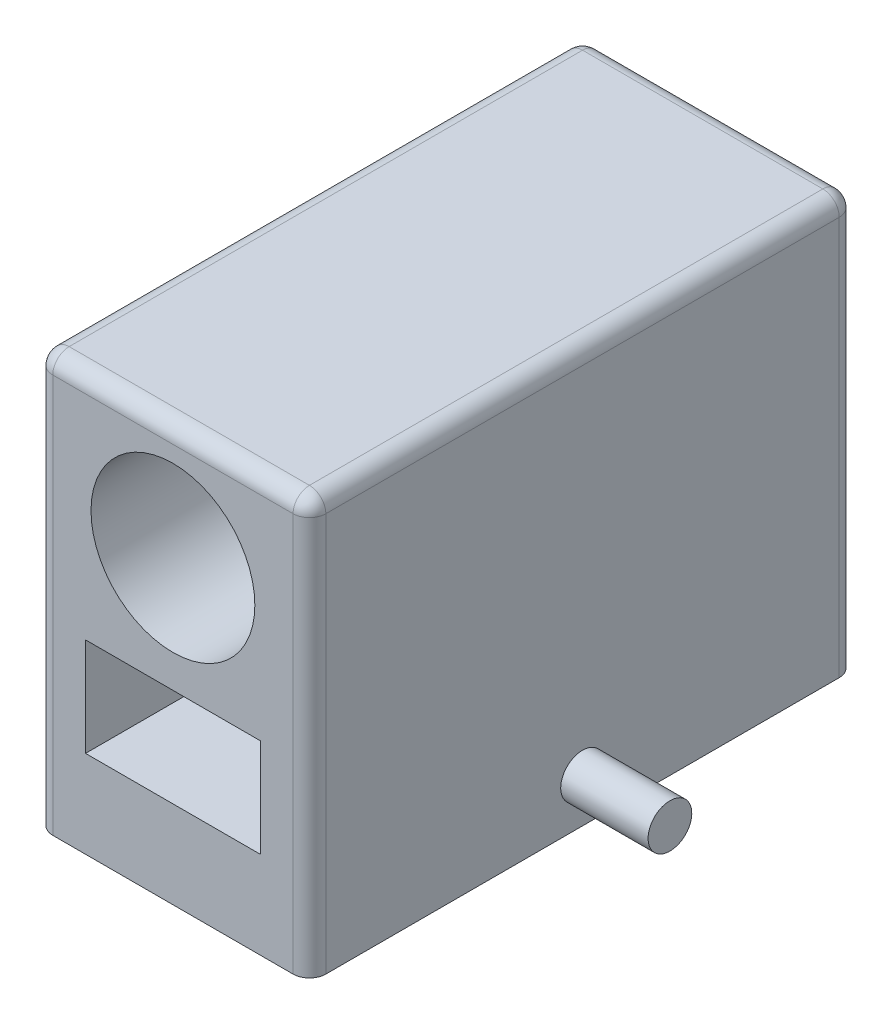
ISO-10303-21;
HEADER;
FILE_DESCRIPTION(('STEP AP214'),'2;1');
FILE_NAME('part.step','',(''),(''),'','','');
FILE_SCHEMA(('AUTOMOTIVE_DESIGN { 1 0 10303 214 1 1 1 1 }'));
ENDSEC;
DATA;
#1=APPLICATION_CONTEXT('core data for automotive mechanical design processes');
#2=APPLICATION_PROTOCOL_DEFINITION('international standard','automotive_design',2000,#1);
#3=PRODUCT_CONTEXT('',#1,'mechanical');
#4=PRODUCT('Part','Part','',(#3));
#5=PRODUCT_RELATED_PRODUCT_CATEGORY('part','',(#4));
#6=PRODUCT_DEFINITION_FORMATION('','',#4);
#7=PRODUCT_DEFINITION_CONTEXT('part definition',#1,'design');
#8=PRODUCT_DEFINITION('design','',#6,#7);
#9=PRODUCT_DEFINITION_SHAPE('','',#8);
#10=(LENGTH_UNIT() NAMED_UNIT(*) SI_UNIT(.MILLI.,.METRE.));
#11=(NAMED_UNIT(*) PLANE_ANGLE_UNIT() SI_UNIT($,.RADIAN.));
#12=(NAMED_UNIT(*) SI_UNIT($,.STERADIAN.) SOLID_ANGLE_UNIT());
#13=UNCERTAINTY_MEASURE_WITH_UNIT(LENGTH_MEASURE(1.E-05),#10,'distance_accuracy_value','');
#14=(GEOMETRIC_REPRESENTATION_CONTEXT(3) GLOBAL_UNCERTAINTY_ASSIGNED_CONTEXT((#13)) GLOBAL_UNIT_ASSIGNED_CONTEXT((#10,
#11,#12)) REPRESENTATION_CONTEXT('',''));
#15=CARTESIAN_POINT('',(0.,0.,0.));
#16=DIRECTION('',(0.,0.,1.));
#17=DIRECTION('',(1.,0.,0.));
#18=AXIS2_PLACEMENT_3D('',#15,#16,#17);
#19=CARTESIAN_POINT('',(25.,0.,-50.));
#20=DIRECTION('',(0.,-1.,0.));
#21=DIRECTION('',(1.,0.,0.));
#22=AXIS2_PLACEMENT_3D('',#19,#20,#21);
#23=PLANE('',#22);
#24=DIRECTION('',(0.,0.,1.));
#25=VECTOR('',#24,1.);
#26=CARTESIAN_POINT('',(25.,0.,-50.));
#27=LINE('',#26,#25);
#28=CARTESIAN_POINT('',(25.,0.,-48.5));
#29=VERTEX_POINT('',#28);
#30=CARTESIAN_POINT('',(25.,0.,-1.5));
#31=VERTEX_POINT('',#30);
#32=EDGE_CURVE('E299',#29,#31,#27,.T.);
#33=ORIENTED_EDGE('',*,*,#32,.T.);
#34=CARTESIAN_POINT('',(23.5,0.,-1.5));
#35=DIRECTION('',(0.,-1.,0.));
#36=DIRECTION('',(1.,0.,0.));
#37=AXIS2_PLACEMENT_3D('',#34,#35,#36);
#38=CIRCLE('',#37,1.5);
#39=CARTESIAN_POINT('',(23.5,0.,0.));
#40=VERTEX_POINT('',#39);
#41=EDGE_CURVE('E12',#31,#40,#38,.T.);
#42=ORIENTED_EDGE('',*,*,#41,.T.);
#43=DIRECTION('',(1.,0.,0.));
#44=VECTOR('',#43,1.);
#45=CARTESIAN_POINT('',(25.,0.,0.));
#46=LINE('',#45,#44);
#47=CARTESIAN_POINT('',(1.50000000000001,0.,0.));
#48=VERTEX_POINT('',#47);
#49=EDGE_CURVE('E295',#48,#40,#46,.T.);
#50=ORIENTED_EDGE('',*,*,#49,.F.);
#51=CARTESIAN_POINT('',(1.5,0.,-1.5));
#52=DIRECTION('',(0.,-1.,0.));
#53=DIRECTION('',(1.,0.,0.));
#54=AXIS2_PLACEMENT_3D('',#51,#52,#53);
#55=CIRCLE('',#54,1.5);
#56=CARTESIAN_POINT('',(0.,0.,-1.5));
#57=VERTEX_POINT('',#56);
#58=EDGE_CURVE('E351',#48,#57,#55,.T.);
#59=ORIENTED_EDGE('',*,*,#58,.T.);
#60=DIRECTION('',(0.,0.,1.));
#61=VECTOR('',#60,1.);
#62=CARTESIAN_POINT('',(0.,0.,-50.));
#63=LINE('',#62,#61);
#64=CARTESIAN_POINT('',(0.,0.,-22.));
#65=VERTEX_POINT('',#64);
#66=EDGE_CURVE('E305',#65,#57,#63,.T.);
#67=ORIENTED_EDGE('',*,*,#66,.F.);
#68=DIRECTION('',(1.,0.,0.));
#69=VECTOR('',#68,1.);
#70=CARTESIAN_POINT('',(-8.,0.,-22.));
#71=LINE('',#70,#69);
#72=CARTESIAN_POINT('',(2.,0.,-22.));
#73=VERTEX_POINT('',#72);
#74=EDGE_CURVE('E240',#65,#73,#71,.T.);
#75=ORIENTED_EDGE('',*,*,#74,.T.);
#76=DIRECTION('',(0.,0.,1.));
#77=VECTOR('',#76,1.);
#78=CARTESIAN_POINT('',(2.,0.,-91.6773319683494));
#79=LINE('',#78,#77);
#80=CARTESIAN_POINT('',(2.00000000000001,0.,-13.));
#81=VERTEX_POINT('',#80);
#82=EDGE_CURVE('E279',#73,#81,#79,.T.);
#83=ORIENTED_EDGE('',*,*,#82,.T.);
#84=DIRECTION('',(1.,0.,0.));
#85=VECTOR('',#84,1.);
#86=CARTESIAN_POINT('',(23.,0.,-13.));
#87=LINE('',#86,#85);
#88=CARTESIAN_POINT('',(23.,0.,-13.));
#89=VERTEX_POINT('',#88);
#90=EDGE_CURVE('E255',#81,#89,#87,.T.);
#91=ORIENTED_EDGE('',*,*,#90,.T.);
#92=DIRECTION('',(0.,0.,1.));
#93=VECTOR('',#92,1.);
#94=CARTESIAN_POINT('',(23.,0.,-91.6773319683494));
#95=LINE('',#94,#93);
#96=CARTESIAN_POINT('',(23.,0.,-48.));
#97=VERTEX_POINT('',#96);
#98=EDGE_CURVE('E274',#97,#89,#95,.T.);
#99=ORIENTED_EDGE('',*,*,#98,.F.);
#100=DIRECTION('',(1.,0.,0.));
#101=VECTOR('',#100,1.);
#102=CARTESIAN_POINT('',(23.,0.,-48.));
#103=LINE('',#102,#101);
#104=CARTESIAN_POINT('',(2.,0.,-48.));
#105=VERTEX_POINT('',#104);
#106=EDGE_CURVE('E271',#105,#97,#103,.T.);
#107=ORIENTED_EDGE('',*,*,#106,.F.);
#108=CARTESIAN_POINT('',(2.,0.,-38.));
#109=VERTEX_POINT('',#108);
#110=EDGE_CURVE('E275',#105,#109,#79,.T.);
#111=ORIENTED_EDGE('',*,*,#110,.T.);
#112=DIRECTION('',(1.,0.,0.));
#113=VECTOR('',#112,1.);
#114=CARTESIAN_POINT('',(-8.,0.,-38.));
#115=LINE('',#114,#113);
#116=CARTESIAN_POINT('',(0.,0.,-38.));
#117=VERTEX_POINT('',#116);
#118=EDGE_CURVE('E239',#117,#109,#115,.T.);
#119=ORIENTED_EDGE('',*,*,#118,.F.);
#120=CARTESIAN_POINT('',(0.,0.,-48.5));
#121=VERTEX_POINT('',#120);
#122=EDGE_CURVE('E302',#121,#117,#63,.T.);
#123=ORIENTED_EDGE('',*,*,#122,.F.);
#124=CARTESIAN_POINT('',(1.5,0.,-48.5));
#125=DIRECTION('',(0.,-1.,0.));
#126=DIRECTION('',(1.,0.,0.));
#127=AXIS2_PLACEMENT_3D('',#124,#125,#126);
#128=CIRCLE('',#127,1.5);
#129=CARTESIAN_POINT('',(1.50000000000001,0.,-50.));
#130=VERTEX_POINT('',#129);
#131=EDGE_CURVE('E353',#121,#130,#128,.T.);
#132=ORIENTED_EDGE('',*,*,#131,.T.);
#133=DIRECTION('',(1.,0.,0.));
#134=VECTOR('',#133,1.);
#135=CARTESIAN_POINT('',(25.,0.,-50.));
#136=LINE('',#135,#134);
#137=CARTESIAN_POINT('',(23.5,0.,-50.));
#138=VERTEX_POINT('',#137);
#139=EDGE_CURVE('E296',#130,#138,#136,.T.);
#140=ORIENTED_EDGE('',*,*,#139,.T.);
#141=CARTESIAN_POINT('',(23.5,0.,-48.5));
#142=DIRECTION('',(0.,-1.,0.));
#143=DIRECTION('',(1.,0.,0.));
#144=AXIS2_PLACEMENT_3D('',#141,#142,#143);
#145=CIRCLE('',#144,1.5);
#146=EDGE_CURVE('E355',#138,#29,#145,.T.);
#147=ORIENTED_EDGE('',*,*,#146,.T.);
#148=EDGE_LOOP('',(#33,#42,#50,#59,#67,#75,#83,#91,#99,#107,#111,#119,#123,#132,#140,#147));
#149=FACE_BOUND('',#148,.T.);
#150=ADVANCED_FACE('F39',(#149),#23,.T.);
#151=CARTESIAN_POINT('',(0.,0.,-50.));
#152=DIRECTION('',(-1.,0.,0.));
#153=DIRECTION('',(0.,-1.,0.));
#154=AXIS2_PLACEMENT_3D('',#151,#152,#153);
#155=PLANE('',#154);
#156=DIRECTION('',(0.,0.,1.));
#157=VECTOR('',#156,1.);
#158=CARTESIAN_POINT('',(0.,36.5,-50.));
#159=LINE('',#158,#157);
#160=CARTESIAN_POINT('',(0.,36.5,-1.5));
#161=VERTEX_POINT('',#160);
#162=CARTESIAN_POINT('',(0.,36.5,-48.5));
#163=VERTEX_POINT('',#162);
#164=EDGE_CURVE('E325',#161,#163,#159,.F.);
#165=ORIENTED_EDGE('',*,*,#164,.T.);
#166=DIRECTION('',(0.,-1.,0.));
#167=VECTOR('',#166,1.);
#168=CARTESIAN_POINT('',(0.,0.,-48.5));
#169=LINE('',#168,#167);
#170=EDGE_CURVE('E359',#163,#121,#169,.T.);
#171=ORIENTED_EDGE('',*,*,#170,.T.);
#172=ORIENTED_EDGE('',*,*,#122,.T.);
#173=DIRECTION('',(0.,-1.,0.));
#174=VECTOR('',#173,1.);
#175=CARTESIAN_POINT('',(0.,0.,-38.));
#176=LINE('',#175,#174);
#177=CARTESIAN_POINT('',(0.,9.,-38.));
#178=VERTEX_POINT('',#177);
#179=EDGE_CURVE('E243',#178,#117,#176,.T.);
#180=ORIENTED_EDGE('',*,*,#179,.F.);
#181=DIRECTION('',(0.,0.,-1.));
#182=VECTOR('',#181,1.);
#183=CARTESIAN_POINT('',(0.,9.,-50.));
#184=LINE('',#183,#182);
#185=CARTESIAN_POINT('',(0.,9.,-22.));
#186=VERTEX_POINT('',#185);
#187=EDGE_CURVE('E251',#186,#178,#184,.T.);
#188=ORIENTED_EDGE('',*,*,#187,.F.);
#189=DIRECTION('',(0.,1.,0.));
#190=VECTOR('',#189,1.);
#191=CARTESIAN_POINT('',(0.,0.,-22.));
#192=LINE('',#191,#190);
#193=EDGE_CURVE('E253',#65,#186,#192,.T.);
#194=ORIENTED_EDGE('',*,*,#193,.F.);
#195=ORIENTED_EDGE('',*,*,#66,.T.);
#196=DIRECTION('',(0.,-1.,0.));
#197=VECTOR('',#196,1.);
#198=CARTESIAN_POINT('',(0.,36.5,-1.5));
#199=LINE('',#198,#197);
#200=EDGE_CURVE('E357',#57,#161,#199,.F.);
#201=ORIENTED_EDGE('',*,*,#200,.T.);
#202=EDGE_LOOP('',(#165,#171,#172,#180,#188,#194,#195,#201));
#203=FACE_BOUND('',#202,.T.);
#204=ADVANCED_FACE('F423',(#203),#155,.T.);
#205=CARTESIAN_POINT('',(0.,38.,-50.));
#206=DIRECTION('',(0.,1.,0.));
#207=DIRECTION('',(-1.,0.,0.));
#208=AXIS2_PLACEMENT_3D('',#205,#206,#207);
#209=PLANE('',#208);
#210=DIRECTION('',(-1.,0.,0.));
#211=VECTOR('',#210,1.);
#212=CARTESIAN_POINT('',(25.,38.,-1.5));
#213=LINE('',#212,#211);
#214=CARTESIAN_POINT('',(1.49999999999999,38.,-1.5));
#215=VERTEX_POINT('',#214);
#216=CARTESIAN_POINT('',(23.5,38.,-1.5));
#217=VERTEX_POINT('',#216);
#218=EDGE_CURVE('E310',#215,#217,#213,.F.);
#219=ORIENTED_EDGE('',*,*,#218,.T.);
#220=DIRECTION('',(0.,0.,1.));
#221=VECTOR('',#220,1.);
#222=CARTESIAN_POINT('',(23.5,38.,-50.));
#223=LINE('',#222,#221);
#224=CARTESIAN_POINT('',(23.5,38.,-48.5));
#225=VERTEX_POINT('',#224);
#226=EDGE_CURVE('E319',#217,#225,#223,.F.);
#227=ORIENTED_EDGE('',*,*,#226,.T.);
#228=DIRECTION('',(-1.,0.,0.));
#229=VECTOR('',#228,1.);
#230=CARTESIAN_POINT('',(0.,38.,-48.5));
#231=LINE('',#230,#229);
#232=CARTESIAN_POINT('',(1.49999999999999,38.,-48.5));
#233=VERTEX_POINT('',#232);
#234=EDGE_CURVE('E316',#225,#233,#231,.T.);
#235=ORIENTED_EDGE('',*,*,#234,.T.);
#236=DIRECTION('',(0.,0.,1.));
#237=VECTOR('',#236,1.);
#238=CARTESIAN_POINT('',(1.49999999999999,38.,-50.));
#239=LINE('',#238,#237);
#240=EDGE_CURVE('E313',#233,#215,#239,.T.);
#241=ORIENTED_EDGE('',*,*,#240,.T.);
#242=EDGE_LOOP('',(#219,#227,#235,#241));
#243=FACE_BOUND('',#242,.T.);
#244=ADVANCED_FACE('F408',(#243),#209,.T.);
#245=CARTESIAN_POINT('',(25.,38.,-50.));
#246=DIRECTION('',(1.,0.,0.));
#247=DIRECTION('',(0.,1.,0.));
#248=AXIS2_PLACEMENT_3D('',#245,#246,#247);
#249=PLANE('',#248);
#250=CARTESIAN_POINT('',(25.,4.,-25.));
#251=DIRECTION('',(1.,0.,0.));
#252=DIRECTION('',(0.,1.,0.));
#253=AXIS2_PLACEMENT_3D('',#250,#251,#252);
#254=CIRCLE('',#253,2.);
#255=CARTESIAN_POINT('',(25.,6.,-25.));
#256=VERTEX_POINT('',#255);
#257=EDGE_CURVE('E205',#256,#256,#254,.T.);
#258=ORIENTED_EDGE('',*,*,#257,.F.);
#259=EDGE_LOOP('',(#258));
#260=FACE_BOUND('',#259,.T.);
#261=DIRECTION('',(0.,0.,1.));
#262=VECTOR('',#261,1.);
#263=CARTESIAN_POINT('',(25.,36.5,-50.));
#264=LINE('',#263,#262);
#265=CARTESIAN_POINT('',(25.,36.5,-48.5));
#266=VERTEX_POINT('',#265);
#267=CARTESIAN_POINT('',(25.,36.5,-1.5));
#268=VERTEX_POINT('',#267);
#269=EDGE_CURVE('E304',#266,#268,#264,.T.);
#270=ORIENTED_EDGE('',*,*,#269,.T.);
#271=DIRECTION('',(0.,1.,0.));
#272=VECTOR('',#271,1.);
#273=CARTESIAN_POINT('',(25.,0.,-1.5));
#274=LINE('',#273,#272);
#275=EDGE_CURVE('E48',#268,#31,#274,.F.);
#276=ORIENTED_EDGE('',*,*,#275,.T.);
#277=ORIENTED_EDGE('',*,*,#32,.F.);
#278=DIRECTION('',(0.,1.,0.));
#279=VECTOR('',#278,1.);
#280=CARTESIAN_POINT('',(25.,38.,-48.5));
#281=LINE('',#280,#279);
#282=EDGE_CURVE('E345',#29,#266,#281,.T.);
#283=ORIENTED_EDGE('',*,*,#282,.T.);
#284=EDGE_LOOP('',(#270,#276,#277,#283));
#285=FACE_BOUND('',#284,.T.);
#286=ADVANCED_FACE('F381',(#260,#285),#249,.T.);
#287=CARTESIAN_POINT('',(0.,0.,-50.));
#288=DIRECTION('',(0.,0.,-1.));
#289=DIRECTION('',(-1.,0.,0.));
#290=AXIS2_PLACEMENT_3D('',#287,#288,#289);
#291=PLANE('',#290);
#292=DIRECTION('',(-1.,0.,0.));
#293=VECTOR('',#292,1.);
#294=CARTESIAN_POINT('',(0.,36.5,-50.));
#295=LINE('',#294,#293);
#296=CARTESIAN_POINT('',(1.49999999999999,36.5,-50.));
#297=VERTEX_POINT('',#296);
#298=CARTESIAN_POINT('',(23.5,36.5,-50.));
#299=VERTEX_POINT('',#298);
#300=EDGE_CURVE('E322',#297,#299,#295,.F.);
#301=ORIENTED_EDGE('',*,*,#300,.T.);
#302=DIRECTION('',(0.,1.,0.));
#303=VECTOR('',#302,1.);
#304=CARTESIAN_POINT('',(23.5,0.,-50.));
#305=LINE('',#304,#303);
#306=EDGE_CURVE('E349',#299,#138,#305,.F.);
#307=ORIENTED_EDGE('',*,*,#306,.T.);
#308=ORIENTED_EDGE('',*,*,#139,.F.);
#309=DIRECTION('',(0.,-1.,0.));
#310=VECTOR('',#309,1.);
#311=CARTESIAN_POINT('',(1.5,0.,-50.));
#312=LINE('',#311,#310);
#313=EDGE_CURVE('E347',#130,#297,#312,.F.);
#314=ORIENTED_EDGE('',*,*,#313,.T.);
#315=EDGE_LOOP('',(#301,#307,#308,#314));
#316=FACE_BOUND('',#315,.T.);
#317=ADVANCED_FACE('F676',(#316),#291,.T.);
#318=CARTESIAN_POINT('',(0.,0.,0.));
#319=DIRECTION('',(0.,0.,-1.));
#320=DIRECTION('',(-1.,0.,0.));
#321=AXIS2_PLACEMENT_3D('',#318,#319,#320);
#322=PLANE('',#321);
#323=DIRECTION('',(0.,-1.,0.));
#324=VECTOR('',#323,1.);
#325=CARTESIAN_POINT('',(4.49999999999999,17.,0.));
#326=LINE('',#325,#324);
#327=CARTESIAN_POINT('',(4.49999999999999,17.,0.));
#328=VERTEX_POINT('',#327);
#329=CARTESIAN_POINT('',(4.49999999999999,8.,0.));
#330=VERTEX_POINT('',#329);
#331=EDGE_CURVE('E211',#328,#330,#326,.T.);
#332=ORIENTED_EDGE('',*,*,#331,.F.);
#333=DIRECTION('',(-1.,0.,0.));
#334=VECTOR('',#333,1.);
#335=CARTESIAN_POINT('',(20.5,17.,0.));
#336=LINE('',#335,#334);
#337=CARTESIAN_POINT('',(20.5,17.,0.));
#338=VERTEX_POINT('',#337);
#339=EDGE_CURVE('E55',#338,#328,#336,.T.);
#340=ORIENTED_EDGE('',*,*,#339,.F.);
#341=DIRECTION('',(0.,1.,0.));
#342=VECTOR('',#341,1.);
#343=CARTESIAN_POINT('',(20.5,8.,0.));
#344=LINE('',#343,#342);
#345=CARTESIAN_POINT('',(20.5,8.,0.));
#346=VERTEX_POINT('',#345);
#347=EDGE_CURVE('E198',#346,#338,#344,.T.);
#348=ORIENTED_EDGE('',*,*,#347,.F.);
#349=DIRECTION('',(1.,0.,0.));
#350=VECTOR('',#349,1.);
#351=CARTESIAN_POINT('',(4.49999999999999,8.,0.));
#352=LINE('',#351,#350);
#353=EDGE_CURVE('E206',#330,#346,#352,.T.);
#354=ORIENTED_EDGE('',*,*,#353,.F.);
#355=EDGE_LOOP('',(#332,#340,#348,#354));
#356=FACE_BOUND('',#355,.T.);
#357=CARTESIAN_POINT('',(12.5,27.5,0.));
#358=DIRECTION('',(0.,0.,1.));
#359=DIRECTION('',(1.,0.,0.));
#360=AXIS2_PLACEMENT_3D('',#357,#358,#359);
#361=CIRCLE('',#360,7.5);
#362=CARTESIAN_POINT('',(20.,27.5,0.));
#363=VERTEX_POINT('',#362);
#364=EDGE_CURVE('E292',#363,#363,#361,.T.);
#365=ORIENTED_EDGE('',*,*,#364,.F.);
#366=EDGE_LOOP('',(#365));
#367=FACE_BOUND('',#366,.T.);
#368=ORIENTED_EDGE('',*,*,#49,.T.);
#369=DIRECTION('',(0.,1.,0.));
#370=VECTOR('',#369,1.);
#371=CARTESIAN_POINT('',(23.5,36.5,0.));
#372=LINE('',#371,#370);
#373=CARTESIAN_POINT('',(23.5,36.5,0.));
#374=VERTEX_POINT('',#373);
#375=EDGE_CURVE('E376',#40,#374,#372,.T.);
#376=ORIENTED_EDGE('',*,*,#375,.T.);
#377=DIRECTION('',(-1.,0.,0.));
#378=VECTOR('',#377,1.);
#379=CARTESIAN_POINT('',(0.,36.5,0.));
#380=LINE('',#379,#378);
#381=CARTESIAN_POINT('',(1.49999999999999,36.5,0.));
#382=VERTEX_POINT('',#381);
#383=EDGE_CURVE('E328',#374,#382,#380,.T.);
#384=ORIENTED_EDGE('',*,*,#383,.T.);
#385=DIRECTION('',(0.,-1.,0.));
#386=VECTOR('',#385,1.);
#387=CARTESIAN_POINT('',(1.5,0.,0.));
#388=LINE('',#387,#386);
#389=EDGE_CURVE('E361',#382,#48,#388,.T.);
#390=ORIENTED_EDGE('',*,*,#389,.T.);
#391=EDGE_LOOP('',(#368,#376,#384,#390));
#392=FACE_BOUND('',#391,.T.);
#393=ADVANCED_FACE('F209',(#356,#367,#392),#322,.F.);
#394=CARTESIAN_POINT('',(12.5,27.5,-13.));
#395=DIRECTION('',(0.,0.,1.));
#396=DIRECTION('',(1.,0.,0.));
#397=AXIS2_PLACEMENT_3D('',#394,#395,#396);
#398=CYLINDRICAL_SURFACE('',#397,7.5);
#399=CARTESIAN_POINT('',(12.5,27.5,-13.));
#400=DIRECTION('',(0.,0.,1.));
#401=DIRECTION('',(1.,0.,0.));
#402=AXIS2_PLACEMENT_3D('',#399,#400,#401);
#403=CIRCLE('',#402,7.5);
#404=CARTESIAN_POINT('',(20.,27.5,-13.));
#405=VERTEX_POINT('',#404);
#406=EDGE_CURVE('E289',#405,#405,#403,.T.);
#407=CARTESIAN_POINT('',(20.,27.5,-13.));
#408=CARTESIAN_POINT('',(20.,27.5,-12.8645833333333));
#409=CARTESIAN_POINT('',(20.,27.5,-12.7291666666667));
#410=CARTESIAN_POINT('',(20.,27.5,-12.4583333333333));
#411=CARTESIAN_POINT('',(20.,27.5,-12.3229166666667));
#412=CARTESIAN_POINT('',(20.,27.5,-12.0520833333333));
#413=CARTESIAN_POINT('',(20.,27.5,-11.9166666666667));
#414=CARTESIAN_POINT('',(20.,27.5,-11.6458333333333));
#415=CARTESIAN_POINT('',(20.,27.5,-11.5104166666667));
#416=CARTESIAN_POINT('',(20.,27.5,-11.2395833333333));
#417=CARTESIAN_POINT('',(20.,27.5,-11.1041666666667));
#418=CARTESIAN_POINT('',(20.,27.5,-10.8333333333333));
#419=CARTESIAN_POINT('',(20.,27.5,-10.6979166666667));
#420=CARTESIAN_POINT('',(20.,27.5,-10.4270833333333));
#421=CARTESIAN_POINT('',(20.,27.5,-10.2916666666667));
#422=CARTESIAN_POINT('',(20.,27.5,-10.0208333333333));
#423=CARTESIAN_POINT('',(20.,27.5,-9.88541666666667));
#424=CARTESIAN_POINT('',(20.,27.5,-9.61458333333333));
#425=CARTESIAN_POINT('',(20.,27.5,-9.47916666666667));
#426=CARTESIAN_POINT('',(20.,27.5,-9.20833333333333));
#427=CARTESIAN_POINT('',(20.,27.5,-9.07291666666667));
#428=CARTESIAN_POINT('',(20.,27.5,-8.80208333333333));
#429=CARTESIAN_POINT('',(20.,27.5,-8.66666666666667));
#430=CARTESIAN_POINT('',(20.,27.5,-8.39583333333333));
#431=CARTESIAN_POINT('',(20.,27.5,-8.26041666666667));
#432=CARTESIAN_POINT('',(20.,27.5,-7.98958333333333));
#433=CARTESIAN_POINT('',(20.,27.5,-7.85416666666667));
#434=CARTESIAN_POINT('',(20.,27.5,-7.58333333333333));
#435=CARTESIAN_POINT('',(20.,27.5,-7.44791666666667));
#436=CARTESIAN_POINT('',(20.,27.5,-7.17708333333333));
#437=CARTESIAN_POINT('',(20.,27.5,-7.04166666666667));
#438=CARTESIAN_POINT('',(20.,27.5,-6.77083333333333));
#439=CARTESIAN_POINT('',(20.,27.5,-6.63541666666667));
#440=CARTESIAN_POINT('',(20.,27.5,-6.36458333333333));
#441=CARTESIAN_POINT('',(20.,27.5,-6.22916666666667));
#442=CARTESIAN_POINT('',(20.,27.5,-5.95833333333333));
#443=CARTESIAN_POINT('',(20.,27.5,-5.82291666666667));
#444=CARTESIAN_POINT('',(20.,27.5,-5.55208333333333));
#445=CARTESIAN_POINT('',(20.,27.5,-5.41666666666667));
#446=CARTESIAN_POINT('',(20.,27.5,-5.14583333333333));
#447=CARTESIAN_POINT('',(20.,27.5,-5.01041666666667));
#448=CARTESIAN_POINT('',(20.,27.5,-4.73958333333333));
#449=CARTESIAN_POINT('',(20.,27.5,-4.60416666666667));
#450=CARTESIAN_POINT('',(20.,27.5,-4.33333333333333));
#451=CARTESIAN_POINT('',(20.,27.5,-4.19791666666667));
#452=CARTESIAN_POINT('',(20.,27.5,-3.92708333333333));
#453=CARTESIAN_POINT('',(20.,27.5,-3.79166666666667));
#454=CARTESIAN_POINT('',(20.,27.5,-3.52083333333333));
#455=CARTESIAN_POINT('',(20.,27.5,-3.38541666666667));
#456=CARTESIAN_POINT('',(20.,27.5,-3.11458333333333));
#457=CARTESIAN_POINT('',(20.,27.5,-2.97916666666667));
#458=CARTESIAN_POINT('',(20.,27.5,-2.70833333333333));
#459=CARTESIAN_POINT('',(20.,27.5,-2.57291666666667));
#460=CARTESIAN_POINT('',(20.,27.5,-2.30208333333333));
#461=CARTESIAN_POINT('',(20.,27.5,-2.16666666666667));
#462=CARTESIAN_POINT('',(20.,27.5,-1.89583333333333));
#463=CARTESIAN_POINT('',(20.,27.5,-1.76041666666667));
#464=CARTESIAN_POINT('',(20.,27.5,-1.48958333333333));
#465=CARTESIAN_POINT('',(20.,27.5,-1.35416666666667));
#466=CARTESIAN_POINT('',(20.,27.5,-1.08333333333333));
#467=CARTESIAN_POINT('',(20.,27.5,-0.947916666666667));
#468=CARTESIAN_POINT('',(20.,27.5,-0.677083333333334));
#469=CARTESIAN_POINT('',(20.,27.5,-0.541666666666667));
#470=CARTESIAN_POINT('',(20.,27.5,-0.270833333333334));
#471=CARTESIAN_POINT('',(20.,27.5,-0.135416666666667));
#472=CARTESIAN_POINT('',(20.,27.5,0.));
#473=B_SPLINE_CURVE_WITH_KNOTS('',3,(#407,#408,#409,#410,#411,#412,#413,#414,#415,#416,#417,
#418,#419,#420,#421,#422,#423,#424,#425,#426,#427,#428,#429,#430,#431,#432,#433,#434,#435,#436,
#437,#438,#439,#440,#441,#442,#443,#444,#445,#446,#447,#448,#449,#450,#451,#452,#453,#454,#455,
#456,#457,#458,#459,#460,#461,#462,#463,#464,#465,#466,#467,#468,#469,#470,#471,#472),
.UNSPECIFIED.,.F.,.F.,(4,2,2,2,2,2,2,2,2,2,2,2,2,2,2,2,2,2,2,2,2,2,2,2,2,2,2,2,2,2,2,2,4),(0.,
0.40625,0.812500000000001,1.21875,1.625,2.03125,2.4375,2.84375,3.25,3.65625,4.0625,4.46875,
4.875,5.28125,5.6875,6.09375,6.5,6.90625,7.3125,7.71875,8.125,8.53125,8.9375,9.34375,9.75,
10.15625,10.5625,10.96875,11.375,11.78125,12.1875,12.59375,13.),.UNSPECIFIED.);
#474=EDGE_CURVE('BSEAM608',#405,#363,#473,.T.);
#475=ORIENTED_EDGE('',*,*,#406,.F.);
#476=ORIENTED_EDGE('',*,*,#364,.T.);
#477=ORIENTED_EDGE('',*,*,#474,.T.);
#478=ORIENTED_EDGE('',*,*,#474,.F.);
#479=EDGE_LOOP('',(#475,#477,#476,#478));
#480=FACE_BOUND('',#479,.T.);
#481=ADVANCED_FACE('F608',(#480),#398,.F.);
#482=CARTESIAN_POINT('',(0.,0.,-13.));
#483=DIRECTION('',(0.,0.,-1.));
#484=DIRECTION('',(-1.,0.,0.));
#485=AXIS2_PLACEMENT_3D('',#482,#483,#484);
#486=PLANE('',#485);
#487=DIRECTION('',(-1.,0.,0.));
#488=VECTOR('',#487,1.);
#489=CARTESIAN_POINT('',(20.5,17.,-13.));
#490=LINE('',#489,#488);
#491=CARTESIAN_POINT('',(20.5,17.,-13.));
#492=VERTEX_POINT('',#491);
#493=CARTESIAN_POINT('',(4.49999999999999,17.,-13.));
#494=VERTEX_POINT('',#493);
#495=EDGE_CURVE('E191',#492,#494,#490,.T.);
#496=ORIENTED_EDGE('',*,*,#495,.T.);
#497=DIRECTION('',(0.,-1.,0.));
#498=VECTOR('',#497,1.);
#499=CARTESIAN_POINT('',(4.49999999999999,17.,-13.));
#500=LINE('',#499,#498);
#501=CARTESIAN_POINT('',(4.49999999999999,8.,-13.));
#502=VERTEX_POINT('',#501);
#503=EDGE_CURVE('E214',#494,#502,#500,.T.);
#504=ORIENTED_EDGE('',*,*,#503,.T.);
#505=DIRECTION('',(1.,0.,0.));
#506=VECTOR('',#505,1.);
#507=CARTESIAN_POINT('',(4.49999999999999,8.,-13.));
#508=LINE('',#507,#506);
#509=CARTESIAN_POINT('',(20.5,8.,-13.));
#510=VERTEX_POINT('',#509);
#511=EDGE_CURVE('E194',#502,#510,#508,.T.);
#512=ORIENTED_EDGE('',*,*,#511,.T.);
#513=DIRECTION('',(0.,1.,0.));
#514=VECTOR('',#513,1.);
#515=CARTESIAN_POINT('',(20.5,8.,-13.));
#516=LINE('',#515,#514);
#517=EDGE_CURVE('E195',#510,#492,#516,.T.);
#518=ORIENTED_EDGE('',*,*,#517,.T.);
#519=EDGE_LOOP('',(#496,#504,#512,#518));
#520=FACE_BOUND('',#519,.T.);
#521=ORIENTED_EDGE('',*,*,#90,.F.);
#522=DIRECTION('',(0.,-1.,0.));
#523=VECTOR('',#522,1.);
#524=CARTESIAN_POINT('',(2.,0.,-13.));
#525=LINE('',#524,#523);
#526=CARTESIAN_POINT('',(1.99999999999999,36.,-13.));
#527=VERTEX_POINT('',#526);
#528=EDGE_CURVE('E256',#527,#81,#525,.T.);
#529=ORIENTED_EDGE('',*,*,#528,.F.);
#530=DIRECTION('',(-1.,0.,0.));
#531=VECTOR('',#530,1.);
#532=CARTESIAN_POINT('',(1.99999999999999,36.,-13.));
#533=LINE('',#532,#531);
#534=CARTESIAN_POINT('',(23.,36.,-13.));
#535=VERTEX_POINT('',#534);
#536=EDGE_CURVE('E260',#535,#527,#533,.T.);
#537=ORIENTED_EDGE('',*,*,#536,.F.);
#538=DIRECTION('',(0.,1.,0.));
#539=VECTOR('',#538,1.);
#540=CARTESIAN_POINT('',(23.,36.,-13.));
#541=LINE('',#540,#539);
#542=EDGE_CURVE('E263',#89,#535,#541,.T.);
#543=ORIENTED_EDGE('',*,*,#542,.F.);
#544=EDGE_LOOP('',(#521,#529,#537,#543));
#545=FACE_BOUND('',#544,.T.);
#546=ORIENTED_EDGE('',*,*,#406,.T.);
#547=EDGE_LOOP('',(#546));
#548=FACE_BOUND('',#547,.T.);
#549=ADVANCED_FACE('F446',(#520,#545,#548),#486,.T.);
#550=CARTESIAN_POINT('',(0.,0.,-48.));
#551=DIRECTION('',(0.,0.,-1.));
#552=DIRECTION('',(-1.,0.,0.));
#553=AXIS2_PLACEMENT_3D('',#550,#551,#552);
#554=PLANE('',#553);
#555=ORIENTED_EDGE('',*,*,#106,.T.);
#556=DIRECTION('',(0.,1.,0.));
#557=VECTOR('',#556,1.);
#558=CARTESIAN_POINT('',(23.,36.,-48.));
#559=LINE('',#558,#557);
#560=CARTESIAN_POINT('',(23.,36.,-48.));
#561=VERTEX_POINT('',#560);
#562=EDGE_CURVE('E259',#97,#561,#559,.T.);
#563=ORIENTED_EDGE('',*,*,#562,.T.);
#564=DIRECTION('',(-1.,0.,0.));
#565=VECTOR('',#564,1.);
#566=CARTESIAN_POINT('',(1.99999999999999,36.,-48.));
#567=LINE('',#566,#565);
#568=CARTESIAN_POINT('',(1.99999999999999,36.,-48.));
#569=VERTEX_POINT('',#568);
#570=EDGE_CURVE('E281',#561,#569,#567,.T.);
#571=ORIENTED_EDGE('',*,*,#570,.T.);
#572=DIRECTION('',(0.,-1.,0.));
#573=VECTOR('',#572,1.);
#574=CARTESIAN_POINT('',(2.,0.,-48.));
#575=LINE('',#574,#573);
#576=EDGE_CURVE('E276',#569,#105,#575,.T.);
#577=ORIENTED_EDGE('',*,*,#576,.T.);
#578=EDGE_LOOP('',(#555,#563,#571,#577));
#579=FACE_BOUND('',#578,.T.);
#580=ADVANCED_FACE('F454',(#579),#554,.F.);
#581=CARTESIAN_POINT('',(23.,36.,-91.6773319683494));
#582=DIRECTION('',(1.,0.,0.));
#583=DIRECTION('',(0.,1.,0.));
#584=AXIS2_PLACEMENT_3D('',#581,#582,#583);
#585=PLANE('',#584);
#586=ORIENTED_EDGE('',*,*,#98,.T.);
#587=ORIENTED_EDGE('',*,*,#542,.T.);
#588=DIRECTION('',(0.,0.,1.));
#589=VECTOR('',#588,1.);
#590=CARTESIAN_POINT('',(23.,36.,-91.6773319683494));
#591=LINE('',#590,#589);
#592=EDGE_CURVE('E270',#561,#535,#591,.T.);
#593=ORIENTED_EDGE('',*,*,#592,.F.);
#594=ORIENTED_EDGE('',*,*,#562,.F.);
#595=EDGE_LOOP('',(#586,#587,#593,#594));
#596=FACE_BOUND('',#595,.T.);
#597=ADVANCED_FACE('F450',(#596),#585,.F.);
#598=CARTESIAN_POINT('',(1.99999999999999,36.,-91.6773319683494));
#599=DIRECTION('',(0.,1.,0.));
#600=DIRECTION('',(0.,0.,1.));
#601=AXIS2_PLACEMENT_3D('',#598,#599,#600);
#602=PLANE('',#601);
#603=ORIENTED_EDGE('',*,*,#592,.T.);
#604=ORIENTED_EDGE('',*,*,#536,.T.);
#605=DIRECTION('',(0.,0.,1.));
#606=VECTOR('',#605,1.);
#607=CARTESIAN_POINT('',(1.99999999999999,36.,-91.6773319683494));
#608=LINE('',#607,#606);
#609=EDGE_CURVE('E280',#569,#527,#608,.T.);
#610=ORIENTED_EDGE('',*,*,#609,.F.);
#611=ORIENTED_EDGE('',*,*,#570,.F.);
#612=EDGE_LOOP('',(#603,#604,#610,#611));
#613=FACE_BOUND('',#612,.T.);
#614=ADVANCED_FACE('F456',(#613),#602,.F.);
#615=CARTESIAN_POINT('',(2.,0.,-91.6773319683494));
#616=DIRECTION('',(-1.,0.,0.));
#617=DIRECTION('',(0.,-1.,0.));
#618=AXIS2_PLACEMENT_3D('',#615,#616,#617);
#619=PLANE('',#618);
#620=ORIENTED_EDGE('',*,*,#82,.F.);
#621=DIRECTION('',(0.,-1.,0.));
#622=VECTOR('',#621,1.);
#623=CARTESIAN_POINT('',(2.,0.,-22.));
#624=LINE('',#623,#622);
#625=CARTESIAN_POINT('',(2.,9.,-22.));
#626=VERTEX_POINT('',#625);
#627=EDGE_CURVE('E237',#626,#73,#624,.T.);
#628=ORIENTED_EDGE('',*,*,#627,.F.);
#629=DIRECTION('',(0.,0.,1.));
#630=VECTOR('',#629,1.);
#631=CARTESIAN_POINT('',(2.,9.,-22.));
#632=LINE('',#631,#630);
#633=CARTESIAN_POINT('',(2.,9.,-38.));
#634=VERTEX_POINT('',#633);
#635=EDGE_CURVE('E233',#634,#626,#632,.T.);
#636=ORIENTED_EDGE('',*,*,#635,.F.);
#637=DIRECTION('',(0.,1.,0.));
#638=VECTOR('',#637,1.);
#639=CARTESIAN_POINT('',(2.,9.,-38.));
#640=LINE('',#639,#638);
#641=EDGE_CURVE('E230',#109,#634,#640,.T.);
#642=ORIENTED_EDGE('',*,*,#641,.F.);
#643=ORIENTED_EDGE('',*,*,#110,.F.);
#644=ORIENTED_EDGE('',*,*,#576,.F.);
#645=ORIENTED_EDGE('',*,*,#609,.T.);
#646=ORIENTED_EDGE('',*,*,#528,.T.);
#647=EDGE_LOOP('',(#620,#628,#636,#642,#643,#644,#645,#646));
#648=FACE_BOUND('',#647,.T.);
#649=ADVANCED_FACE('F438',(#648),#619,.F.);
#650=CARTESIAN_POINT('',(-8.,0.,-22.));
#651=DIRECTION('',(0.,0.,1.));
#652=DIRECTION('',(1.,0.,0.));
#653=AXIS2_PLACEMENT_3D('',#650,#651,#652);
#654=PLANE('',#653);
#655=ORIENTED_EDGE('',*,*,#193,.T.);
#656=DIRECTION('',(1.,0.,0.));
#657=VECTOR('',#656,1.);
#658=CARTESIAN_POINT('',(-8.,9.,-22.));
#659=LINE('',#658,#657);
#660=EDGE_CURVE('E244',#186,#626,#659,.T.);
#661=ORIENTED_EDGE('',*,*,#660,.T.);
#662=ORIENTED_EDGE('',*,*,#627,.T.);
#663=ORIENTED_EDGE('',*,*,#74,.F.);
#664=EDGE_LOOP('',(#655,#661,#662,#663));
#665=FACE_BOUND('',#664,.T.);
#666=ADVANCED_FACE('F429',(#665),#654,.F.);
#667=CARTESIAN_POINT('',(-8.,9.,-22.));
#668=DIRECTION('',(0.,1.,0.));
#669=DIRECTION('',(0.,0.,1.));
#670=AXIS2_PLACEMENT_3D('',#667,#668,#669);
#671=PLANE('',#670);
#672=ORIENTED_EDGE('',*,*,#187,.T.);
#673=DIRECTION('',(1.,0.,0.));
#674=VECTOR('',#673,1.);
#675=CARTESIAN_POINT('',(-8.,9.,-38.));
#676=LINE('',#675,#674);
#677=EDGE_CURVE('E246',#178,#634,#676,.T.);
#678=ORIENTED_EDGE('',*,*,#677,.T.);
#679=ORIENTED_EDGE('',*,*,#635,.T.);
#680=ORIENTED_EDGE('',*,*,#660,.F.);
#681=EDGE_LOOP('',(#672,#678,#679,#680));
#682=FACE_BOUND('',#681,.T.);
#683=ADVANCED_FACE('F431',(#682),#671,.F.);
#684=CARTESIAN_POINT('',(-8.,9.,-38.));
#685=DIRECTION('',(0.,0.,-1.));
#686=DIRECTION('',(-1.,0.,0.));
#687=AXIS2_PLACEMENT_3D('',#684,#685,#686);
#688=PLANE('',#687);
#689=ORIENTED_EDGE('',*,*,#179,.T.);
#690=ORIENTED_EDGE('',*,*,#118,.T.);
#691=ORIENTED_EDGE('',*,*,#641,.T.);
#692=ORIENTED_EDGE('',*,*,#677,.F.);
#693=EDGE_LOOP('',(#689,#690,#691,#692));
#694=FACE_BOUND('',#693,.T.);
#695=ADVANCED_FACE('F486',(#694),#688,.F.);
#696=CARTESIAN_POINT('',(1.49999999999999,36.5,-50.));
#697=DIRECTION('',(0.,0.,1.));
#698=DIRECTION('',(1.,0.,0.));
#699=AXIS2_PLACEMENT_3D('',#696,#697,#698);
#700=CYLINDRICAL_SURFACE('',#699,1.5);
#701=ORIENTED_EDGE('',*,*,#240,.F.);
#702=CARTESIAN_POINT('',(1.49999999999999,36.5,-48.5));
#703=DIRECTION('',(0.,0.,1.));
#704=DIRECTION('',(1.,0.,0.));
#705=AXIS2_PLACEMENT_3D('',#702,#703,#704);
#706=CIRCLE('',#705,1.5);
#707=EDGE_CURVE('E340',#233,#163,#706,.T.);
#708=ORIENTED_EDGE('',*,*,#707,.T.);
#709=ORIENTED_EDGE('',*,*,#164,.F.);
#710=CARTESIAN_POINT('',(1.49999999999999,36.5,-1.5));
#711=DIRECTION('',(0.,0.,1.));
#712=DIRECTION('',(1.,0.,0.));
#713=AXIS2_PLACEMENT_3D('',#710,#711,#712);
#714=CIRCLE('',#713,1.5);
#715=EDGE_CURVE('E338',#161,#215,#714,.F.);
#716=ORIENTED_EDGE('',*,*,#715,.T.);
#717=EDGE_LOOP('',(#701,#708,#709,#716));
#718=FACE_BOUND('',#717,.T.);
#719=ADVANCED_FACE('F482',(#718),#700,.T.);
#720=CARTESIAN_POINT('',(0.,36.5,-48.5));
#721=DIRECTION('',(-1.,0.,0.));
#722=DIRECTION('',(0.,-1.,0.));
#723=AXIS2_PLACEMENT_3D('',#720,#721,#722);
#724=CYLINDRICAL_SURFACE('',#723,1.5);
#725=ORIENTED_EDGE('',*,*,#234,.F.);
#726=CARTESIAN_POINT('',(23.5,36.5,-48.5));
#727=DIRECTION('',(-1.,0.,0.));
#728=DIRECTION('',(0.,-1.,0.));
#729=AXIS2_PLACEMENT_3D('',#726,#727,#728);
#730=CIRCLE('',#729,1.5);
#731=EDGE_CURVE('E336',#225,#299,#730,.T.);
#732=ORIENTED_EDGE('',*,*,#731,.T.);
#733=ORIENTED_EDGE('',*,*,#300,.F.);
#734=CARTESIAN_POINT('',(1.49999999999999,36.5,-48.5));
#735=DIRECTION('',(-1.,0.,0.));
#736=DIRECTION('',(0.,-1.,0.));
#737=AXIS2_PLACEMENT_3D('',#734,#735,#736);
#738=CIRCLE('',#737,1.5);
#739=EDGE_CURVE('E333',#297,#233,#738,.F.);
#740=ORIENTED_EDGE('',*,*,#739,.T.);
#741=EDGE_LOOP('',(#725,#732,#733,#740));
#742=FACE_BOUND('',#741,.T.);
#743=ADVANCED_FACE('F479',(#742),#724,.T.);
#744=CARTESIAN_POINT('',(0.,36.5,-1.5));
#745=DIRECTION('',(1.,0.,0.));
#746=DIRECTION('',(0.,1.,0.));
#747=AXIS2_PLACEMENT_3D('',#744,#745,#746);
#748=CYLINDRICAL_SURFACE('',#747,1.5);
#749=ORIENTED_EDGE('',*,*,#383,.F.);
#750=CARTESIAN_POINT('',(23.5,36.5,-1.5));
#751=DIRECTION('',(1.,0.,0.));
#752=DIRECTION('',(0.,1.,0.));
#753=AXIS2_PLACEMENT_3D('',#750,#751,#752);
#754=CIRCLE('',#753,1.5);
#755=EDGE_CURVE('E374',#374,#217,#754,.F.);
#756=ORIENTED_EDGE('',*,*,#755,.T.);
#757=ORIENTED_EDGE('',*,*,#218,.F.);
#758=CARTESIAN_POINT('',(1.49999999999999,36.5,-1.5));
#759=DIRECTION('',(1.,0.,0.));
#760=DIRECTION('',(0.,1.,0.));
#761=AXIS2_PLACEMENT_3D('',#758,#759,#760);
#762=CIRCLE('',#761,1.5);
#763=EDGE_CURVE('E342',#215,#382,#762,.T.);
#764=ORIENTED_EDGE('',*,*,#763,.T.);
#765=EDGE_LOOP('',(#749,#756,#757,#764));
#766=FACE_BOUND('',#765,.T.);
#767=ADVANCED_FACE('F395',(#766),#748,.T.);
#768=CARTESIAN_POINT('',(23.5,36.5,-50.));
#769=DIRECTION('',(0.,0.,1.));
#770=DIRECTION('',(1.,0.,0.));
#771=AXIS2_PLACEMENT_3D('',#768,#769,#770);
#772=CYLINDRICAL_SURFACE('',#771,1.5);
#773=ORIENTED_EDGE('',*,*,#226,.F.);
#774=CARTESIAN_POINT('',(23.5,36.5,-1.5));
#775=DIRECTION('',(0.,0.,1.));
#776=DIRECTION('',(1.,0.,0.));
#777=AXIS2_PLACEMENT_3D('',#774,#775,#776);
#778=CIRCLE('',#777,1.5);
#779=EDGE_CURVE('E363',#217,#268,#778,.F.);
#780=ORIENTED_EDGE('',*,*,#779,.T.);
#781=ORIENTED_EDGE('',*,*,#269,.F.);
#782=CARTESIAN_POINT('',(23.5,36.5,-48.5));
#783=DIRECTION('',(0.,0.,1.));
#784=DIRECTION('',(1.,0.,0.));
#785=AXIS2_PLACEMENT_3D('',#782,#783,#784);
#786=CIRCLE('',#785,1.5);
#787=EDGE_CURVE('E330',#266,#225,#786,.T.);
#788=ORIENTED_EDGE('',*,*,#787,.T.);
#789=EDGE_LOOP('',(#773,#780,#781,#788));
#790=FACE_BOUND('',#789,.T.);
#791=ADVANCED_FACE('F403',(#790),#772,.T.);
#792=CARTESIAN_POINT('',(23.5,38.,-48.5));
#793=DIRECTION('',(0.,1.,0.));
#794=DIRECTION('',(-1.,0.,0.));
#795=AXIS2_PLACEMENT_3D('',#792,#793,#794);
#796=CYLINDRICAL_SURFACE('',#795,1.5);
#797=ORIENTED_EDGE('',*,*,#146,.F.);
#798=ORIENTED_EDGE('',*,*,#306,.F.);
#799=CARTESIAN_POINT('',(23.5,36.5,-48.5));
#800=DIRECTION('',(0.,1.,0.));
#801=DIRECTION('',(0.,0.,1.));
#802=AXIS2_PLACEMENT_3D('',#799,#800,#801);
#803=CIRCLE('',#802,1.5);
#804=EDGE_CURVE('E234',#266,#299,#803,.T.);
#805=ORIENTED_EDGE('',*,*,#804,.F.);
#806=ORIENTED_EDGE('',*,*,#282,.F.);
#807=EDGE_LOOP('',(#797,#798,#805,#806));
#808=FACE_BOUND('',#807,.T.);
#809=ADVANCED_FACE('F476',(#808),#796,.T.);
#810=CARTESIAN_POINT('',(23.5,36.5,-48.5));
#811=DIRECTION('',(0.,0.,1.));
#812=DIRECTION('',(1.,0.,0.));
#813=AXIS2_PLACEMENT_3D('',#810,#811,#812);
#814=SPHERICAL_SURFACE('',#813,1.5);
#815=ORIENTED_EDGE('',*,*,#804,.T.);
#816=ORIENTED_EDGE('',*,*,#731,.F.);
#817=ORIENTED_EDGE('',*,*,#787,.F.);
#818=EDGE_LOOP('',(#815,#816,#817));
#819=FACE_BOUND('',#818,.T.);
#820=ADVANCED_FACE('F488',(#819),#814,.T.);
#821=CARTESIAN_POINT('',(1.5,0.,-48.5));
#822=DIRECTION('',(0.,-1.,0.));
#823=DIRECTION('',(1.,0.,0.));
#824=AXIS2_PLACEMENT_3D('',#821,#822,#823);
#825=CYLINDRICAL_SURFACE('',#824,1.5);
#826=ORIENTED_EDGE('',*,*,#131,.F.);
#827=ORIENTED_EDGE('',*,*,#170,.F.);
#828=CARTESIAN_POINT('',(1.49999999999999,36.5,-48.5));
#829=DIRECTION('',(0.,1.,0.));
#830=DIRECTION('',(0.,0.,1.));
#831=AXIS2_PLACEMENT_3D('',#828,#829,#830);
#832=CIRCLE('',#831,1.5);
#833=EDGE_CURVE('E366',#297,#163,#832,.T.);
#834=ORIENTED_EDGE('',*,*,#833,.F.);
#835=ORIENTED_EDGE('',*,*,#313,.F.);
#836=EDGE_LOOP('',(#826,#827,#834,#835));
#837=FACE_BOUND('',#836,.T.);
#838=ADVANCED_FACE('F491',(#837),#825,.T.);
#839=CARTESIAN_POINT('',(1.49999999999999,36.5,-48.5));
#840=DIRECTION('',(0.,0.,1.));
#841=DIRECTION('',(1.,0.,0.));
#842=AXIS2_PLACEMENT_3D('',#839,#840,#841);
#843=SPHERICAL_SURFACE('',#842,1.5);
#844=ORIENTED_EDGE('',*,*,#833,.T.);
#845=ORIENTED_EDGE('',*,*,#707,.F.);
#846=ORIENTED_EDGE('',*,*,#739,.F.);
#847=EDGE_LOOP('',(#844,#845,#846));
#848=FACE_BOUND('',#847,.T.);
#849=ADVANCED_FACE('F496',(#848),#843,.T.);
#850=CARTESIAN_POINT('',(1.5,0.,-1.5));
#851=DIRECTION('',(0.,1.,0.));
#852=DIRECTION('',(-1.,0.,0.));
#853=AXIS2_PLACEMENT_3D('',#850,#851,#852);
#854=CYLINDRICAL_SURFACE('',#853,1.5);
#855=ORIENTED_EDGE('',*,*,#58,.F.);
#856=ORIENTED_EDGE('',*,*,#389,.F.);
#857=CARTESIAN_POINT('',(1.49999999999999,36.5,-1.5));
#858=DIRECTION('',(0.,1.,0.));
#859=DIRECTION('',(0.,0.,1.));
#860=AXIS2_PLACEMENT_3D('',#857,#858,#859);
#861=CIRCLE('',#860,1.5);
#862=EDGE_CURVE('E369',#161,#382,#861,.T.);
#863=ORIENTED_EDGE('',*,*,#862,.F.);
#864=ORIENTED_EDGE('',*,*,#200,.F.);
#865=EDGE_LOOP('',(#855,#856,#863,#864));
#866=FACE_BOUND('',#865,.T.);
#867=ADVANCED_FACE('F418',(#866),#854,.T.);
#868=CARTESIAN_POINT('',(1.49999999999999,36.5,-1.5));
#869=DIRECTION('',(0.,0.,1.));
#870=DIRECTION('',(1.,0.,0.));
#871=AXIS2_PLACEMENT_3D('',#868,#869,#870);
#872=SPHERICAL_SURFACE('',#871,1.5);
#873=ORIENTED_EDGE('',*,*,#763,.F.);
#874=ORIENTED_EDGE('',*,*,#715,.F.);
#875=ORIENTED_EDGE('',*,*,#862,.T.);
#876=EDGE_LOOP('',(#873,#874,#875));
#877=FACE_BOUND('',#876,.T.);
#878=ADVANCED_FACE('F412',(#877),#872,.T.);
#879=CARTESIAN_POINT('',(23.5,0.,-1.5));
#880=DIRECTION('',(0.,-1.,0.));
#881=DIRECTION('',(1.,0.,0.));
#882=AXIS2_PLACEMENT_3D('',#879,#880,#881);
#883=CYLINDRICAL_SURFACE('',#882,1.5);
#884=ORIENTED_EDGE('',*,*,#41,.F.);
#885=ORIENTED_EDGE('',*,*,#275,.F.);
#886=CARTESIAN_POINT('',(23.5,36.5,-1.5));
#887=DIRECTION('',(0.,1.,0.));
#888=DIRECTION('',(0.,0.,1.));
#889=AXIS2_PLACEMENT_3D('',#886,#887,#888);
#890=CIRCLE('',#889,1.5);
#891=EDGE_CURVE('E43',#374,#268,#890,.T.);
#892=ORIENTED_EDGE('',*,*,#891,.F.);
#893=ORIENTED_EDGE('',*,*,#375,.F.);
#894=EDGE_LOOP('',(#884,#885,#892,#893));
#895=FACE_BOUND('',#894,.T.);
#896=ADVANCED_FACE('F41',(#895),#883,.T.);
#897=CARTESIAN_POINT('',(23.5,36.5,-1.5));
#898=DIRECTION('',(0.,0.,1.));
#899=DIRECTION('',(1.,0.,0.));
#900=AXIS2_PLACEMENT_3D('',#897,#898,#899);
#901=SPHERICAL_SURFACE('',#900,1.5);
#902=ORIENTED_EDGE('',*,*,#779,.F.);
#903=ORIENTED_EDGE('',*,*,#755,.F.);
#904=ORIENTED_EDGE('',*,*,#891,.T.);
#905=EDGE_LOOP('',(#902,#903,#904));
#906=FACE_BOUND('',#905,.T.);
#907=ADVANCED_FACE('F400',(#906),#901,.T.);
#908=CARTESIAN_POINT('',(33.,4.,-25.));
#909=DIRECTION('',(-1.,0.,0.));
#910=DIRECTION('',(0.,-1.,0.));
#911=AXIS2_PLACEMENT_3D('',#908,#909,#910);
#912=CYLINDRICAL_SURFACE('',#911,2.);
#913=CARTESIAN_POINT('',(33.,4.,-25.));
#914=DIRECTION('',(1.,0.,0.));
#915=DIRECTION('',(0.,1.,0.));
#916=AXIS2_PLACEMENT_3D('',#913,#914,#915);
#917=CIRCLE('',#916,2.);
#918=CARTESIAN_POINT('',(33.,6.,-25.));
#919=VERTEX_POINT('',#918);
#920=EDGE_CURVE('E225',#919,#919,#917,.T.);
#921=ORIENTED_EDGE('',*,*,#920,.F.);
#922=EDGE_LOOP('',(#921));
#923=FACE_BOUND('',#922,.T.);
#924=ORIENTED_EDGE('',*,*,#257,.T.);
#925=EDGE_LOOP('',(#924));
#926=FACE_BOUND('',#925,.T.);
#927=ADVANCED_FACE('F507',(#923,#926),#912,.T.);
#928=CARTESIAN_POINT('',(33.,4.,-25.));
#929=DIRECTION('',(1.,0.,0.));
#930=DIRECTION('',(0.,1.,0.));
#931=AXIS2_PLACEMENT_3D('',#928,#929,#930);
#932=PLANE('',#931);
#933=ORIENTED_EDGE('',*,*,#920,.T.);
#934=EDGE_LOOP('',(#933));
#935=FACE_BOUND('',#934,.T.);
#936=ADVANCED_FACE('F512',(#935),#932,.T.);
#937=CARTESIAN_POINT('',(20.5,17.,-50.001));
#938=DIRECTION('',(0.,1.,0.));
#939=DIRECTION('',(0.,0.,1.));
#940=AXIS2_PLACEMENT_3D('',#937,#938,#939);
#941=PLANE('',#940);
#942=DIRECTION('',(0.,0.,1.));
#943=VECTOR('',#942,1.);
#944=CARTESIAN_POINT('',(20.5,17.,-50.001));
#945=LINE('',#944,#943);
#946=EDGE_CURVE('E187',#492,#338,#945,.T.);
#947=ORIENTED_EDGE('',*,*,#946,.T.);
#948=ORIENTED_EDGE('',*,*,#339,.T.);
#949=DIRECTION('',(0.,0.,1.));
#950=VECTOR('',#949,1.);
#951=CARTESIAN_POINT('',(4.49999999999999,17.,-50.001));
#952=LINE('',#951,#950);
#953=EDGE_CURVE('E219',#494,#328,#952,.T.);
#954=ORIENTED_EDGE('',*,*,#953,.F.);
#955=ORIENTED_EDGE('',*,*,#495,.F.);
#956=EDGE_LOOP('',(#947,#948,#954,#955));
#957=FACE_BOUND('',#956,.T.);
#958=ADVANCED_FACE('F189',(#957),#941,.F.);
#959=CARTESIAN_POINT('',(20.5,8.,-50.001));
#960=DIRECTION('',(1.,0.,0.));
#961=DIRECTION('',(0.,1.,0.));
#962=AXIS2_PLACEMENT_3D('',#959,#960,#961);
#963=PLANE('',#962);
#964=DIRECTION('',(0.,0.,1.));
#965=VECTOR('',#964,1.);
#966=CARTESIAN_POINT('',(20.5,8.,-50.001));
#967=LINE('',#966,#965);
#968=EDGE_CURVE('E201',#510,#346,#967,.T.);
#969=ORIENTED_EDGE('',*,*,#968,.T.);
#970=ORIENTED_EDGE('',*,*,#347,.T.);
#971=ORIENTED_EDGE('',*,*,#946,.F.);
#972=ORIENTED_EDGE('',*,*,#517,.F.);
#973=EDGE_LOOP('',(#969,#970,#971,#972));
#974=FACE_BOUND('',#973,.T.);
#975=ADVANCED_FACE('F199',(#974),#963,.F.);
#976=CARTESIAN_POINT('',(4.49999999999999,8.,-50.001));
#977=DIRECTION('',(0.,-1.,0.));
#978=DIRECTION('',(1.,0.,0.));
#979=AXIS2_PLACEMENT_3D('',#976,#977,#978);
#980=PLANE('',#979);
#981=DIRECTION('',(0.,0.,1.));
#982=VECTOR('',#981,1.);
#983=CARTESIAN_POINT('',(4.49999999999999,8.,-50.001));
#984=LINE('',#983,#982);
#985=EDGE_CURVE('E63',#502,#330,#984,.T.);
#986=ORIENTED_EDGE('',*,*,#985,.T.);
#987=ORIENTED_EDGE('',*,*,#353,.T.);
#988=ORIENTED_EDGE('',*,*,#968,.F.);
#989=ORIENTED_EDGE('',*,*,#511,.F.);
#990=EDGE_LOOP('',(#986,#987,#988,#989));
#991=FACE_BOUND('',#990,.T.);
#992=ADVANCED_FACE('F646',(#991),#980,.F.);
#993=CARTESIAN_POINT('',(4.49999999999999,17.,-50.001));
#994=DIRECTION('',(-1.,0.,0.));
#995=DIRECTION('',(0.,-1.,0.));
#996=AXIS2_PLACEMENT_3D('',#993,#994,#995);
#997=PLANE('',#996);
#998=ORIENTED_EDGE('',*,*,#953,.T.);
#999=ORIENTED_EDGE('',*,*,#331,.T.);
#1000=ORIENTED_EDGE('',*,*,#985,.F.);
#1001=ORIENTED_EDGE('',*,*,#503,.F.);
#1002=EDGE_LOOP('',(#998,#999,#1000,#1001));
#1003=FACE_BOUND('',#1002,.T.);
#1004=ADVANCED_FACE('F655',(#1003),#997,.F.);
#1005=CLOSED_SHELL('',(#150,#204,#244,#286,#317,#393,#481,#549,#580,#597,#614,#649,#666,#683,
#695,#719,#743,#767,#791,#809,#820,#838,#849,#867,#878,#896,#907,#927,#936,#958,#975,#992,#1004));
#1006=MANIFOLD_SOLID_BREP('B2',#1005);
#1007=ADVANCED_BREP_SHAPE_REPRESENTATION('',(#18,#1006),#14);
#1008=SHAPE_DEFINITION_REPRESENTATION(#9,#1007);
ENDSEC;
END-ISO-10303-21;
